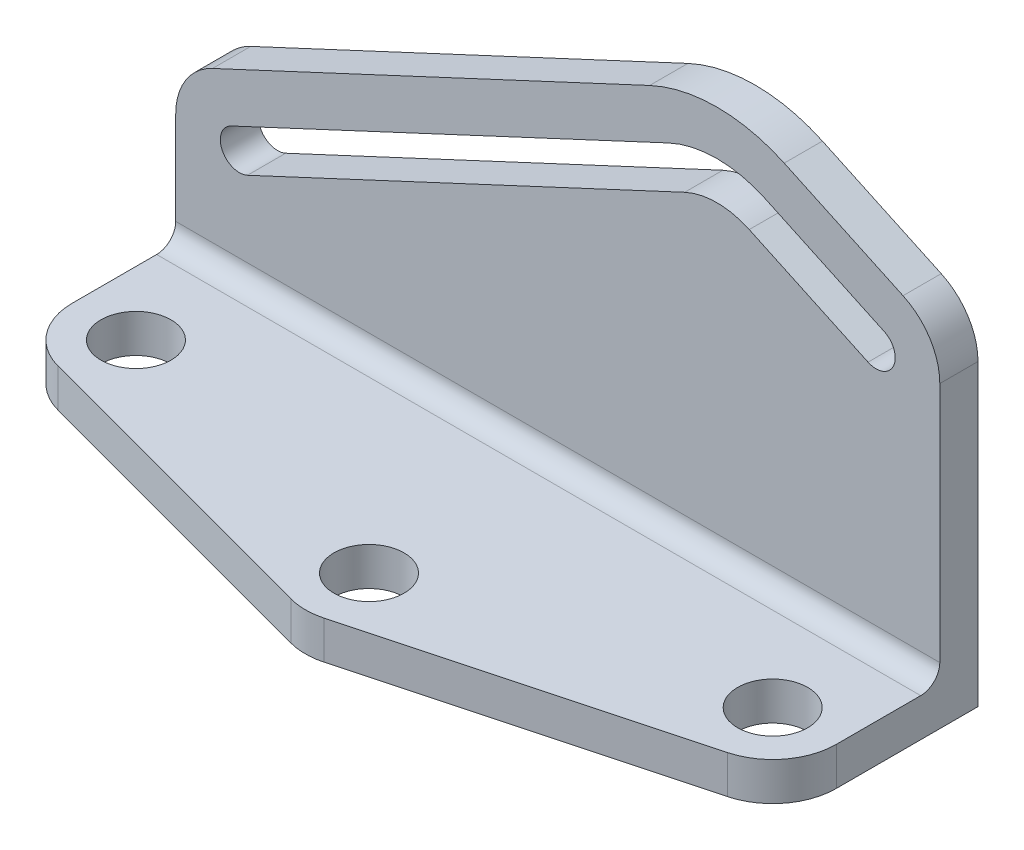
ISO-10303-21;
HEADER;
FILE_DESCRIPTION(('STEP AP214'),'2;1');
FILE_NAME('part.step','',(''),(''),'','','');
FILE_SCHEMA(('AUTOMOTIVE_DESIGN { 1 0 10303 214 1 1 1 1 }'));
ENDSEC;
DATA;
#1=APPLICATION_CONTEXT('core data for automotive mechanical design processes');
#2=APPLICATION_PROTOCOL_DEFINITION('international standard','automotive_design',2000,#1);
#3=PRODUCT_CONTEXT('',#1,'mechanical');
#4=PRODUCT('Part','Part','',(#3));
#5=PRODUCT_RELATED_PRODUCT_CATEGORY('part','',(#4));
#6=PRODUCT_DEFINITION_FORMATION('','',#4);
#7=PRODUCT_DEFINITION_CONTEXT('part definition',#1,'design');
#8=PRODUCT_DEFINITION('design','',#6,#7);
#9=PRODUCT_DEFINITION_SHAPE('','',#8);
#10=(LENGTH_UNIT() NAMED_UNIT(*) SI_UNIT(.MILLI.,.METRE.));
#11=(NAMED_UNIT(*) PLANE_ANGLE_UNIT() SI_UNIT($,.RADIAN.));
#12=(NAMED_UNIT(*) SI_UNIT($,.STERADIAN.) SOLID_ANGLE_UNIT());
#13=UNCERTAINTY_MEASURE_WITH_UNIT(LENGTH_MEASURE(1.E-05),#10,'distance_accuracy_value','');
#14=(GEOMETRIC_REPRESENTATION_CONTEXT(3) GLOBAL_UNCERTAINTY_ASSIGNED_CONTEXT((#13)) GLOBAL_UNIT_ASSIGNED_CONTEXT((#10,
#11,#12)) REPRESENTATION_CONTEXT('',''));
#15=CARTESIAN_POINT('',(0.,0.,0.));
#16=DIRECTION('',(0.,0.,1.));
#17=DIRECTION('',(1.,0.,0.));
#18=AXIS2_PLACEMENT_3D('',#15,#16,#17);
#19=CARTESIAN_POINT('',(60.,0.,6.));
#20=DIRECTION('',(0.,1.,0.));
#21=DIRECTION('',(0.,0.,1.));
#22=AXIS2_PLACEMENT_3D('',#19,#20,#21);
#23=PLANE('',#22);
#24=DIRECTION('',(1.,0.,0.));
#25=VECTOR('',#24,1.);
#26=CARTESIAN_POINT('',(60.,0.,0.));
#27=LINE('',#26,#25);
#28=CARTESIAN_POINT('',(-60.,0.,0.));
#29=VERTEX_POINT('',#28);
#30=CARTESIAN_POINT('',(60.,0.,0.));
#31=VERTEX_POINT('',#30);
#32=EDGE_CURVE('E318',#29,#31,#27,.T.);
#33=ORIENTED_EDGE('',*,*,#32,.T.);
#34=DIRECTION('',(0.,0.,-1.));
#35=VECTOR('',#34,1.);
#36=CARTESIAN_POINT('',(60.,0.,6.));
#37=LINE('',#36,#35);
#38=CARTESIAN_POINT('',(60.,0.,22.249778574343));
#39=VERTEX_POINT('',#38);
#40=EDGE_CURVE('E381',#39,#31,#37,.T.);
#41=ORIENTED_EDGE('',*,*,#40,.F.);
#42=CARTESIAN_POINT('',(50.,0.,22.249778574343));
#43=DIRECTION('',(0.,-1.,0.));
#44=DIRECTION('',(0.,0.,1.));
#45=AXIS2_PLACEMENT_3D('',#42,#43,#44);
#46=CIRCLE('',#45,9.99999999999999);
#47=CARTESIAN_POINT('',(52.5881904510252,0.,31.9090368372337));
#48=VERTEX_POINT('',#47);
#49=EDGE_CURVE('E277',#39,#48,#46,.T.);
#50=ORIENTED_EDGE('',*,*,#49,.T.);
#51=DIRECTION('',(-0.965925826289068,0.,0.258819045102522));
#52=VECTOR('',#51,1.);
#53=CARTESIAN_POINT('',(2.58819045102522,0.,45.3064964587899));
#54=LINE('',#53,#52);
#55=CARTESIAN_POINT('',(2.58819045102522,0.,45.3064964587899));
#56=VERTEX_POINT('',#55);
#57=EDGE_CURVE('E304',#48,#56,#54,.T.);
#58=ORIENTED_EDGE('',*,*,#57,.T.);
#59=CARTESIAN_POINT('',(0.,0.,35.6472381958992));
#60=DIRECTION('',(0.,-1.,0.));
#61=DIRECTION('',(0.,0.,1.));
#62=AXIS2_PLACEMENT_3D('',#59,#60,#61);
#63=CIRCLE('',#62,10.);
#64=CARTESIAN_POINT('',(-2.58819045102521,0.,45.3064964587899));
#65=VERTEX_POINT('',#64);
#66=EDGE_CURVE('E307',#56,#65,#63,.T.);
#67=ORIENTED_EDGE('',*,*,#66,.T.);
#68=DIRECTION('',(-0.965925826289068,0.,-0.258819045102521));
#69=VECTOR('',#68,1.);
#70=CARTESIAN_POINT('',(-52.5881904510252,0.,31.9090368372337));
#71=LINE('',#70,#69);
#72=CARTESIAN_POINT('',(-52.5881904510252,0.,31.9090368372337));
#73=VERTEX_POINT('',#72);
#74=EDGE_CURVE('E310',#65,#73,#71,.T.);
#75=ORIENTED_EDGE('',*,*,#74,.T.);
#76=CARTESIAN_POINT('',(-50.,0.,22.249778574343));
#77=DIRECTION('',(0.,-1.,0.));
#78=DIRECTION('',(0.,0.,1.));
#79=AXIS2_PLACEMENT_3D('',#76,#77,#78);
#80=CIRCLE('',#79,10.);
#81=CARTESIAN_POINT('',(-60.,0.,22.249778574343));
#82=VERTEX_POINT('',#81);
#83=EDGE_CURVE('E284',#73,#82,#80,.T.);
#84=ORIENTED_EDGE('',*,*,#83,.T.);
#85=DIRECTION('',(0.,0.,-1.));
#86=VECTOR('',#85,1.);
#87=CARTESIAN_POINT('',(-60.,0.,6.));
#88=LINE('',#87,#86);
#89=EDGE_CURVE('E345',#82,#29,#88,.T.);
#90=ORIENTED_EDGE('',*,*,#89,.T.);
#91=EDGE_LOOP('',(#33,#41,#50,#58,#67,#75,#84,#90));
#92=FACE_BOUND('',#91,.T.);
#93=CARTESIAN_POINT('',(50.,0.,22.249778574343));
#94=DIRECTION('',(0.,-1.,0.));
#95=DIRECTION('',(0.,0.,-1.));
#96=AXIS2_PLACEMENT_3D('',#93,#94,#95);
#97=CIRCLE('',#96,5.5);
#98=CARTESIAN_POINT('',(50.,0.,16.749778574343));
#99=VERTEX_POINT('',#98);
#100=EDGE_CURVE('E250',#99,#99,#97,.T.);
#101=ORIENTED_EDGE('',*,*,#100,.F.);
#102=EDGE_LOOP('',(#101));
#103=FACE_BOUND('',#102,.T.);
#104=CARTESIAN_POINT('',(0.,0.,35.6472381958992));
#105=DIRECTION('',(0.,-1.,0.));
#106=DIRECTION('',(0.,0.,-1.));
#107=AXIS2_PLACEMENT_3D('',#104,#105,#106);
#108=CIRCLE('',#107,5.50000000000001);
#109=CARTESIAN_POINT('',(0.,0.,30.1472381958992));
#110=VERTEX_POINT('',#109);
#111=EDGE_CURVE('E265',#110,#110,#108,.T.);
#112=ORIENTED_EDGE('',*,*,#111,.F.);
#113=EDGE_LOOP('',(#112));
#114=FACE_BOUND('',#113,.T.);
#115=CARTESIAN_POINT('',(-50.,0.,22.249778574343));
#116=DIRECTION('',(0.,-1.,0.));
#117=DIRECTION('',(0.,0.,-1.));
#118=AXIS2_PLACEMENT_3D('',#115,#116,#117);
#119=CIRCLE('',#118,5.5);
#120=CARTESIAN_POINT('',(-50.,0.,16.749778574343));
#121=VERTEX_POINT('',#120);
#122=EDGE_CURVE('E271',#121,#121,#119,.T.);
#123=ORIENTED_EDGE('',*,*,#122,.F.);
#124=EDGE_LOOP('',(#123));
#125=FACE_BOUND('',#124,.T.);
#126=ADVANCED_FACE('F39',(#92,#103,#114,#125),#23,.F.);
#127=CARTESIAN_POINT('',(60.,46.9446802996746,6.));
#128=DIRECTION('',(-1.,0.,0.));
#129=DIRECTION('',(0.,-1.,0.));
#130=AXIS2_PLACEMENT_3D('',#127,#128,#129);
#131=PLANE('',#130);
#132=DIRECTION('',(0.,1.,0.));
#133=VECTOR('',#132,1.);
#134=CARTESIAN_POINT('',(60.,46.9446802996746,0.));
#135=LINE('',#134,#133);
#136=CARTESIAN_POINT('',(60.,46.9446802996746,0.));
#137=VERTEX_POINT('',#136);
#138=EDGE_CURVE('E348',#31,#137,#135,.T.);
#139=ORIENTED_EDGE('',*,*,#138,.T.);
#140=DIRECTION('',(0.,0.,-1.));
#141=VECTOR('',#140,1.);
#142=CARTESIAN_POINT('',(60.,46.9446802996746,6.));
#143=LINE('',#142,#141);
#144=CARTESIAN_POINT('',(60.,46.9446802996746,6.));
#145=VERTEX_POINT('',#144);
#146=EDGE_CURVE('E378',#145,#137,#143,.T.);
#147=ORIENTED_EDGE('',*,*,#146,.F.);
#148=DIRECTION('',(0.,1.,0.));
#149=VECTOR('',#148,1.);
#150=CARTESIAN_POINT('',(60.,46.9446802996746,6.));
#151=LINE('',#150,#149);
#152=CARTESIAN_POINT('',(60.,9.,6.));
#153=VERTEX_POINT('',#152);
#154=EDGE_CURVE('E329',#153,#145,#151,.T.);
#155=ORIENTED_EDGE('',*,*,#154,.F.);
#156=CARTESIAN_POINT('',(60.,9.,9.));
#157=DIRECTION('',(-1.,0.,0.));
#158=DIRECTION('',(0.,-1.,0.));
#159=AXIS2_PLACEMENT_3D('',#156,#157,#158);
#160=CIRCLE('',#159,3.);
#161=CARTESIAN_POINT('',(60.,6.,9.));
#162=VERTEX_POINT('',#161);
#163=EDGE_CURVE('E47',#153,#162,#160,.T.);
#164=ORIENTED_EDGE('',*,*,#163,.T.);
#165=DIRECTION('',(0.,0.,1.));
#166=VECTOR('',#165,1.);
#167=CARTESIAN_POINT('',(60.,6.,22.249778574343));
#168=LINE('',#167,#166);
#169=CARTESIAN_POINT('',(60.,6.,22.249778574343));
#170=VERTEX_POINT('',#169);
#171=EDGE_CURVE('E283',#162,#170,#168,.T.);
#172=ORIENTED_EDGE('',*,*,#171,.T.);
#173=DIRECTION('',(0.,-1.,0.));
#174=VECTOR('',#173,1.);
#175=CARTESIAN_POINT('',(60.,6.,22.249778574343));
#176=LINE('',#175,#174);
#177=EDGE_CURVE('E301',#170,#39,#176,.T.);
#178=ORIENTED_EDGE('',*,*,#177,.T.);
#179=ORIENTED_EDGE('',*,*,#40,.T.);
#180=EDGE_LOOP('',(#139,#147,#155,#164,#172,#178,#179));
#181=FACE_BOUND('',#180,.T.);
#182=ADVANCED_FACE('F391',(#181),#131,.F.);
#183=CARTESIAN_POINT('',(50.,46.9446802996746,6.));
#184=DIRECTION('',(0.,0.,-1.));
#185=DIRECTION('',(-1.,0.,0.));
#186=AXIS2_PLACEMENT_3D('',#183,#184,#185);
#187=CYLINDRICAL_SURFACE('',#186,9.99999999999999);
#188=CARTESIAN_POINT('',(50.,46.9446802996746,0.));
#189=DIRECTION('',(0.,0.,1.));
#190=DIRECTION('',(-1.,0.,0.));
#191=AXIS2_PLACEMENT_3D('',#188,#189,#190);
#192=CIRCLE('',#191,9.99999999999999);
#193=CARTESIAN_POINT('',(54.226182617407,56.007758170041,0.));
#194=VERTEX_POINT('',#193);
#195=EDGE_CURVE('E350',#137,#194,#192,.T.);
#196=ORIENTED_EDGE('',*,*,#195,.T.);
#197=DIRECTION('',(0.,0.,-1.));
#198=VECTOR('',#197,1.);
#199=CARTESIAN_POINT('',(54.226182617407,56.007758170041,6.));
#200=LINE('',#199,#198);
#201=CARTESIAN_POINT('',(54.226182617407,56.007758170041,6.));
#202=VERTEX_POINT('',#201);
#203=EDGE_CURVE('E375',#202,#194,#200,.T.);
#204=ORIENTED_EDGE('',*,*,#203,.F.);
#205=CARTESIAN_POINT('',(50.,46.9446802996746,6.));
#206=DIRECTION('',(0.,0.,1.));
#207=DIRECTION('',(-1.,0.,0.));
#208=AXIS2_PLACEMENT_3D('',#205,#206,#207);
#209=CIRCLE('',#208,9.99999999999999);
#210=EDGE_CURVE('E331',#145,#202,#209,.T.);
#211=ORIENTED_EDGE('',*,*,#210,.F.);
#212=ORIENTED_EDGE('',*,*,#146,.T.);
#213=EDGE_LOOP('',(#196,#204,#211,#212));
#214=FACE_BOUND('',#213,.T.);
#215=ADVANCED_FACE('F440',(#214),#187,.T.);
#216=CARTESIAN_POINT('',(35.5654565435175,64.7093976450285,6.));
#217=DIRECTION('',(-0.422618261740703,-0.906307787036648,0.));
#218=DIRECTION('',(0.906307787036648,-0.422618261740704,0.));
#219=AXIS2_PLACEMENT_3D('',#216,#217,#218);
#220=PLANE('',#219);
#221=DIRECTION('',(-0.906307787036648,0.422618261740704,0.));
#222=VECTOR('',#221,1.);
#223=CARTESIAN_POINT('',(35.5654565435175,64.7093976450285,0.));
#224=LINE('',#223,#222);
#225=CARTESIAN_POINT('',(35.5654565435175,64.7093976450285,0.));
#226=VERTEX_POINT('',#225);
#227=EDGE_CURVE('E352',#194,#226,#224,.T.);
#228=ORIENTED_EDGE('',*,*,#227,.T.);
#229=DIRECTION('',(0.,0.,-1.));
#230=VECTOR('',#229,1.);
#231=CARTESIAN_POINT('',(35.5654565435175,64.7093976450285,6.));
#232=LINE('',#231,#230);
#233=CARTESIAN_POINT('',(35.5654565435175,64.7093976450285,6.));
#234=VERTEX_POINT('',#233);
#235=EDGE_CURVE('E372',#234,#226,#232,.T.);
#236=ORIENTED_EDGE('',*,*,#235,.F.);
#237=DIRECTION('',(-0.906307787036648,0.422618261740704,0.));
#238=VECTOR('',#237,1.);
#239=CARTESIAN_POINT('',(35.5654565435175,64.7093976450285,6.));
#240=LINE('',#239,#238);
#241=EDGE_CURVE('E334',#202,#234,#240,.T.);
#242=ORIENTED_EDGE('',*,*,#241,.F.);
#243=ORIENTED_EDGE('',*,*,#203,.T.);
#244=EDGE_LOOP('',(#228,#236,#242,#243));
#245=FACE_BOUND('',#244,.T.);
#246=ADVANCED_FACE('F446',(#245),#220,.F.);
#247=CARTESIAN_POINT('',(24.9999999999999,42.0517029691123,6.));
#248=DIRECTION('',(0.,0.,-1.));
#249=DIRECTION('',(-1.,0.,0.));
#250=AXIS2_PLACEMENT_3D('',#247,#248,#249);
#251=CYLINDRICAL_SURFACE('',#250,25.);
#252=CARTESIAN_POINT('',(24.9999999999999,42.0517029691123,0.));
#253=DIRECTION('',(0.,0.,1.));
#254=DIRECTION('',(-1.,0.,0.));
#255=AXIS2_PLACEMENT_3D('',#252,#253,#254);
#256=CIRCLE('',#255,25.);
#257=CARTESIAN_POINT('',(14.4345434564825,64.7093976450285,0.));
#258=VERTEX_POINT('',#257);
#259=EDGE_CURVE('E354',#226,#258,#256,.T.);
#260=ORIENTED_EDGE('',*,*,#259,.T.);
#261=DIRECTION('',(0.,0.,-1.));
#262=VECTOR('',#261,1.);
#263=CARTESIAN_POINT('',(14.4345434564825,64.7093976450285,6.));
#264=LINE('',#263,#262);
#265=CARTESIAN_POINT('',(14.4345434564825,64.7093976450285,6.));
#266=VERTEX_POINT('',#265);
#267=EDGE_CURVE('E369',#266,#258,#264,.T.);
#268=ORIENTED_EDGE('',*,*,#267,.F.);
#269=CARTESIAN_POINT('',(24.9999999999999,42.0517029691123,6.));
#270=DIRECTION('',(0.,0.,1.));
#271=DIRECTION('',(-1.,0.,0.));
#272=AXIS2_PLACEMENT_3D('',#269,#270,#271);
#273=CIRCLE('',#272,25.);
#274=EDGE_CURVE('E336',#234,#266,#273,.T.);
#275=ORIENTED_EDGE('',*,*,#274,.F.);
#276=ORIENTED_EDGE('',*,*,#235,.T.);
#277=EDGE_LOOP('',(#260,#268,#275,#276));
#278=FACE_BOUND('',#277,.T.);
#279=ADVANCED_FACE('F450',(#278),#251,.T.);
#280=CARTESIAN_POINT('',(-54.226182617407,32.6923752622915,6.));
#281=DIRECTION('',(0.422618261740697,-0.906307787036651,0.));
#282=DIRECTION('',(0.906307787036651,0.422618261740697,0.));
#283=AXIS2_PLACEMENT_3D('',#280,#281,#282);
#284=PLANE('',#283);
#285=DIRECTION('',(-0.906307787036651,-0.422618261740697,0.));
#286=VECTOR('',#285,1.);
#287=CARTESIAN_POINT('',(-54.226182617407,32.6923752622915,0.));
#288=LINE('',#287,#286);
#289=CARTESIAN_POINT('',(-54.226182617407,32.6923752622915,0.));
#290=VERTEX_POINT('',#289);
#291=EDGE_CURVE('E356',#258,#290,#288,.T.);
#292=ORIENTED_EDGE('',*,*,#291,.T.);
#293=DIRECTION('',(0.,0.,-1.));
#294=VECTOR('',#293,1.);
#295=CARTESIAN_POINT('',(-54.226182617407,32.6923752622915,6.));
#296=LINE('',#295,#294);
#297=CARTESIAN_POINT('',(-54.226182617407,32.6923752622915,6.));
#298=VERTEX_POINT('',#297);
#299=EDGE_CURVE('E366',#298,#290,#296,.T.);
#300=ORIENTED_EDGE('',*,*,#299,.F.);
#301=DIRECTION('',(-0.906307787036651,-0.422618261740697,0.));
#302=VECTOR('',#301,1.);
#303=CARTESIAN_POINT('',(-54.226182617407,32.6923752622915,6.));
#304=LINE('',#303,#302);
#305=EDGE_CURVE('E338',#266,#298,#304,.T.);
#306=ORIENTED_EDGE('',*,*,#305,.F.);
#307=ORIENTED_EDGE('',*,*,#267,.T.);
#308=EDGE_LOOP('',(#292,#300,#306,#307));
#309=FACE_BOUND('',#308,.T.);
#310=ADVANCED_FACE('F453',(#309),#284,.F.);
#311=CARTESIAN_POINT('',(-50.,23.629297391925,6.));
#312=DIRECTION('',(0.,0.,-1.));
#313=DIRECTION('',(-1.,0.,0.));
#314=AXIS2_PLACEMENT_3D('',#311,#312,#313);
#315=CYLINDRICAL_SURFACE('',#314,10.);
#316=CARTESIAN_POINT('',(-50.,23.629297391925,0.));
#317=DIRECTION('',(0.,0.,1.));
#318=DIRECTION('',(-1.,0.,0.));
#319=AXIS2_PLACEMENT_3D('',#316,#317,#318);
#320=CIRCLE('',#319,10.);
#321=CARTESIAN_POINT('',(-60.,23.629297391925,0.));
#322=VERTEX_POINT('',#321);
#323=EDGE_CURVE('E358',#290,#322,#320,.T.);
#324=ORIENTED_EDGE('',*,*,#323,.T.);
#325=DIRECTION('',(0.,0.,-1.));
#326=VECTOR('',#325,1.);
#327=CARTESIAN_POINT('',(-60.,23.629297391925,6.));
#328=LINE('',#327,#326);
#329=CARTESIAN_POINT('',(-60.,23.629297391925,6.));
#330=VERTEX_POINT('',#329);
#331=EDGE_CURVE('E363',#330,#322,#328,.T.);
#332=ORIENTED_EDGE('',*,*,#331,.F.);
#333=CARTESIAN_POINT('',(-50.,23.629297391925,6.));
#334=DIRECTION('',(0.,0.,1.));
#335=DIRECTION('',(-1.,0.,0.));
#336=AXIS2_PLACEMENT_3D('',#333,#334,#335);
#337=CIRCLE('',#336,10.);
#338=EDGE_CURVE('E340',#298,#330,#337,.T.);
#339=ORIENTED_EDGE('',*,*,#338,.F.);
#340=ORIENTED_EDGE('',*,*,#299,.T.);
#341=EDGE_LOOP('',(#324,#332,#339,#340));
#342=FACE_BOUND('',#341,.T.);
#343=ADVANCED_FACE('F413',(#342),#315,.T.);
#344=CARTESIAN_POINT('',(-60.,0.,6.));
#345=DIRECTION('',(1.,0.,0.));
#346=DIRECTION('',(0.,0.,-1.));
#347=AXIS2_PLACEMENT_3D('',#344,#345,#346);
#348=PLANE('',#347);
#349=DIRECTION('',(0.,-1.,0.));
#350=VECTOR('',#349,1.);
#351=CARTESIAN_POINT('',(-60.,0.,0.));
#352=LINE('',#351,#350);
#353=EDGE_CURVE('E332',#322,#29,#352,.T.);
#354=ORIENTED_EDGE('',*,*,#353,.T.);
#355=ORIENTED_EDGE('',*,*,#89,.F.);
#356=DIRECTION('',(0.,-1.,0.));
#357=VECTOR('',#356,1.);
#358=CARTESIAN_POINT('',(-60.,6.,22.249778574343));
#359=LINE('',#358,#357);
#360=CARTESIAN_POINT('',(-60.,6.,22.249778574343));
#361=VERTEX_POINT('',#360);
#362=EDGE_CURVE('E315',#361,#82,#359,.T.);
#363=ORIENTED_EDGE('',*,*,#362,.F.);
#364=DIRECTION('',(0.,0.,-1.));
#365=VECTOR('',#364,1.);
#366=CARTESIAN_POINT('',(-60.,6.,6.));
#367=LINE('',#366,#365);
#368=CARTESIAN_POINT('',(-60.,6.,9.));
#369=VERTEX_POINT('',#368);
#370=EDGE_CURVE('E280',#361,#369,#367,.T.);
#371=ORIENTED_EDGE('',*,*,#370,.T.);
#372=CARTESIAN_POINT('',(-60.,9.,9.));
#373=DIRECTION('',(1.,0.,0.));
#374=DIRECTION('',(0.,0.,-1.));
#375=AXIS2_PLACEMENT_3D('',#372,#373,#374);
#376=CIRCLE('',#375,3.);
#377=CARTESIAN_POINT('',(-60.,9.,6.));
#378=VERTEX_POINT('',#377);
#379=EDGE_CURVE('E11',#369,#378,#376,.T.);
#380=ORIENTED_EDGE('',*,*,#379,.T.);
#381=DIRECTION('',(0.,-1.,0.));
#382=VECTOR('',#381,1.);
#383=CARTESIAN_POINT('',(-60.,0.,6.));
#384=LINE('',#383,#382);
#385=EDGE_CURVE('E342',#330,#378,#384,.T.);
#386=ORIENTED_EDGE('',*,*,#385,.F.);
#387=ORIENTED_EDGE('',*,*,#331,.T.);
#388=EDGE_LOOP('',(#354,#355,#363,#371,#380,#386,#387));
#389=FACE_BOUND('',#388,.T.);
#390=ADVANCED_FACE('F405',(#389),#348,.F.);
#391=CARTESIAN_POINT('',(-50.,23.629297391925,6.));
#392=DIRECTION('',(0.,0.,-1.));
#393=DIRECTION('',(-1.,0.,0.));
#394=AXIS2_PLACEMENT_3D('',#391,#392,#393);
#395=PLANE('',#394);
#396=DIRECTION('',(-0.906307787036648,0.422618261740703,0.));
#397=VECTOR('',#396,1.);
#398=CARTESIAN_POINT('',(51.2678547852221,49.6636036607845,6.));
#399=LINE('',#398,#397);
#400=CARTESIAN_POINT('',(51.2678547852221,49.6636036607845,6.));
#401=VERTEX_POINT('',#400);
#402=CARTESIAN_POINT('',(32.6071287113325,58.365243135772,6.));
#403=VERTEX_POINT('',#402);
#404=EDGE_CURVE('E232',#401,#403,#399,.T.);
#405=ORIENTED_EDGE('',*,*,#404,.F.);
#406=CARTESIAN_POINT('',(50.,46.9446802996745,6.));
#407=DIRECTION('',(0.,0.,1.));
#408=DIRECTION('',(-1.,0.,0.));
#409=AXIS2_PLACEMENT_3D('',#406,#407,#408);
#410=CIRCLE('',#409,3.);
#411=CARTESIAN_POINT('',(48.7321452147779,44.2257569385646,6.));
#412=VERTEX_POINT('',#411);
#413=EDGE_CURVE('E54',#412,#401,#410,.T.);
#414=ORIENTED_EDGE('',*,*,#413,.F.);
#415=DIRECTION('',(0.906307787036648,-0.422618261740703,0.));
#416=VECTOR('',#415,1.);
#417=CARTESIAN_POINT('',(48.7321452147779,44.2257569385646,6.));
#418=LINE('',#417,#416);
#419=CARTESIAN_POINT('',(30.0714191408883,52.9273964135521,6.));
#420=VERTEX_POINT('',#419);
#421=EDGE_CURVE('E212',#420,#412,#418,.T.);
#422=ORIENTED_EDGE('',*,*,#421,.F.);
#423=CARTESIAN_POINT('',(24.9999999999999,42.0517029691123,6.));
#424=DIRECTION('',(0.,0.,-1.));
#425=DIRECTION('',(1.,0.,0.));
#426=AXIS2_PLACEMENT_3D('',#423,#424,#425);
#427=CIRCLE('',#426,12.);
#428=CARTESIAN_POINT('',(19.9285808591115,52.9273964135521,6.));
#429=VERTEX_POINT('',#428);
#430=EDGE_CURVE('E215',#429,#420,#427,.T.);
#431=ORIENTED_EDGE('',*,*,#430,.F.);
#432=DIRECTION('',(0.906307787036651,0.422618261740697,0.));
#433=VECTOR('',#432,1.);
#434=CARTESIAN_POINT('',(19.9285808591115,52.9273964135521,6.));
#435=LINE('',#434,#433);
#436=CARTESIAN_POINT('',(-48.7321452147779,20.9103740308151,6.));
#437=VERTEX_POINT('',#436);
#438=EDGE_CURVE('E243',#437,#429,#435,.T.);
#439=ORIENTED_EDGE('',*,*,#438,.F.);
#440=CARTESIAN_POINT('',(-50.,23.629297391925,6.));
#441=DIRECTION('',(0.,0.,1.));
#442=DIRECTION('',(1.,0.,0.));
#443=AXIS2_PLACEMENT_3D('',#440,#441,#442);
#444=CIRCLE('',#443,3.);
#445=CARTESIAN_POINT('',(-51.2678547852221,26.348220753035,6.));
#446=VERTEX_POINT('',#445);
#447=EDGE_CURVE('E240',#446,#437,#444,.T.);
#448=ORIENTED_EDGE('',*,*,#447,.F.);
#449=DIRECTION('',(-0.906307787036651,-0.422618261740697,0.));
#450=VECTOR('',#449,1.);
#451=CARTESIAN_POINT('',(17.3928712886673,58.365243135772,6.));
#452=LINE('',#451,#450);
#453=CARTESIAN_POINT('',(17.3928712886673,58.365243135772,6.));
#454=VERTEX_POINT('',#453);
#455=EDGE_CURVE('E237',#454,#446,#452,.T.);
#456=ORIENTED_EDGE('',*,*,#455,.F.);
#457=CARTESIAN_POINT('',(24.9999999999999,42.0517029691123,6.));
#458=DIRECTION('',(0.,0.,1.));
#459=DIRECTION('',(1.,0.,0.));
#460=AXIS2_PLACEMENT_3D('',#457,#458,#459);
#461=CIRCLE('',#460,18.);
#462=EDGE_CURVE('E234',#403,#454,#461,.T.);
#463=ORIENTED_EDGE('',*,*,#462,.F.);
#464=EDGE_LOOP('',(#405,#414,#422,#431,#439,#448,#456,#463));
#465=FACE_BOUND('',#464,.T.);
#466=ORIENTED_EDGE('',*,*,#385,.T.);
#467=DIRECTION('',(1.,0.,0.));
#468=VECTOR('',#467,1.);
#469=CARTESIAN_POINT('',(-50.,9.,6.));
#470=LINE('',#469,#468);
#471=EDGE_CURVE('E384',#378,#153,#470,.T.);
#472=ORIENTED_EDGE('',*,*,#471,.T.);
#473=ORIENTED_EDGE('',*,*,#154,.T.);
#474=ORIENTED_EDGE('',*,*,#210,.T.);
#475=ORIENTED_EDGE('',*,*,#241,.T.);
#476=ORIENTED_EDGE('',*,*,#274,.T.);
#477=ORIENTED_EDGE('',*,*,#305,.T.);
#478=ORIENTED_EDGE('',*,*,#338,.T.);
#479=EDGE_LOOP('',(#466,#472,#473,#474,#475,#476,#477,#478));
#480=FACE_BOUND('',#479,.T.);
#481=ADVANCED_FACE('F407',(#465,#480),#395,.F.);
#482=CARTESIAN_POINT('',(-50.,23.629297391925,0.));
#483=DIRECTION('',(0.,0.,-1.));
#484=DIRECTION('',(-1.,0.,0.));
#485=AXIS2_PLACEMENT_3D('',#482,#483,#484);
#486=PLANE('',#485);
#487=CARTESIAN_POINT('',(50.,46.9446802996745,0.));
#488=DIRECTION('',(0.,0.,1.));
#489=DIRECTION('',(-1.,0.,0.));
#490=AXIS2_PLACEMENT_3D('',#487,#488,#489);
#491=CIRCLE('',#490,3.);
#492=CARTESIAN_POINT('',(48.7321452147779,44.2257569385646,0.));
#493=VERTEX_POINT('',#492);
#494=CARTESIAN_POINT('',(51.2678547852221,49.6636036607845,0.));
#495=VERTEX_POINT('',#494);
#496=EDGE_CURVE('E195',#493,#495,#491,.T.);
#497=ORIENTED_EDGE('',*,*,#496,.T.);
#498=DIRECTION('',(-0.906307787036648,0.422618261740703,0.));
#499=VECTOR('',#498,1.);
#500=CARTESIAN_POINT('',(51.2678547852221,49.6636036607845,0.));
#501=LINE('',#500,#499);
#502=CARTESIAN_POINT('',(32.6071287113325,58.3652431357719,0.));
#503=VERTEX_POINT('',#502);
#504=EDGE_CURVE('E204',#495,#503,#501,.T.);
#505=ORIENTED_EDGE('',*,*,#504,.T.);
#506=CARTESIAN_POINT('',(24.9999999999999,42.0517029691123,0.));
#507=DIRECTION('',(0.,0.,1.));
#508=DIRECTION('',(1.,0.,0.));
#509=AXIS2_PLACEMENT_3D('',#506,#507,#508);
#510=CIRCLE('',#509,18.);
#511=CARTESIAN_POINT('',(17.3928712886673,58.365243135772,0.));
#512=VERTEX_POINT('',#511);
#513=EDGE_CURVE('E62',#503,#512,#510,.T.);
#514=ORIENTED_EDGE('',*,*,#513,.T.);
#515=DIRECTION('',(-0.906307787036651,-0.422618261740697,0.));
#516=VECTOR('',#515,1.);
#517=CARTESIAN_POINT('',(17.3928712886673,58.365243135772,0.));
#518=LINE('',#517,#516);
#519=CARTESIAN_POINT('',(-51.2678547852221,26.348220753035,0.));
#520=VERTEX_POINT('',#519);
#521=EDGE_CURVE('E219',#512,#520,#518,.T.);
#522=ORIENTED_EDGE('',*,*,#521,.T.);
#523=CARTESIAN_POINT('',(-50.,23.629297391925,0.));
#524=DIRECTION('',(0.,0.,1.));
#525=DIRECTION('',(1.,0.,0.));
#526=AXIS2_PLACEMENT_3D('',#523,#524,#525);
#527=CIRCLE('',#526,3.);
#528=CARTESIAN_POINT('',(-48.7321452147779,20.9103740308151,0.));
#529=VERTEX_POINT('',#528);
#530=EDGE_CURVE('E222',#520,#529,#527,.T.);
#531=ORIENTED_EDGE('',*,*,#530,.T.);
#532=DIRECTION('',(0.906307787036651,0.422618261740697,0.));
#533=VECTOR('',#532,1.);
#534=CARTESIAN_POINT('',(19.9285808591115,52.9273964135521,0.));
#535=LINE('',#534,#533);
#536=CARTESIAN_POINT('',(19.9285808591115,52.9273964135521,0.));
#537=VERTEX_POINT('',#536);
#538=EDGE_CURVE('E225',#529,#537,#535,.T.);
#539=ORIENTED_EDGE('',*,*,#538,.T.);
#540=CARTESIAN_POINT('',(24.9999999999999,42.0517029691123,0.));
#541=DIRECTION('',(0.,0.,-1.));
#542=DIRECTION('',(1.,0.,0.));
#543=AXIS2_PLACEMENT_3D('',#540,#541,#542);
#544=CIRCLE('',#543,12.);
#545=CARTESIAN_POINT('',(30.0714191408883,52.9273964135521,0.));
#546=VERTEX_POINT('',#545);
#547=EDGE_CURVE('E228',#537,#546,#544,.T.);
#548=ORIENTED_EDGE('',*,*,#547,.T.);
#549=DIRECTION('',(0.906307787036648,-0.422618261740703,0.));
#550=VECTOR('',#549,1.);
#551=CARTESIAN_POINT('',(48.7321452147779,44.2257569385646,0.));
#552=LINE('',#551,#550);
#553=EDGE_CURVE('E201',#546,#493,#552,.T.);
#554=ORIENTED_EDGE('',*,*,#553,.T.);
#555=EDGE_LOOP('',(#497,#505,#514,#522,#531,#539,#548,#554));
#556=FACE_BOUND('',#555,.T.);
#557=ORIENTED_EDGE('',*,*,#32,.F.);
#558=ORIENTED_EDGE('',*,*,#353,.F.);
#559=ORIENTED_EDGE('',*,*,#323,.F.);
#560=ORIENTED_EDGE('',*,*,#291,.F.);
#561=ORIENTED_EDGE('',*,*,#259,.F.);
#562=ORIENTED_EDGE('',*,*,#227,.F.);
#563=ORIENTED_EDGE('',*,*,#195,.F.);
#564=ORIENTED_EDGE('',*,*,#138,.F.);
#565=EDGE_LOOP('',(#557,#558,#559,#560,#561,#562,#563,#564));
#566=FACE_BOUND('',#565,.T.);
#567=ADVANCED_FACE('F208',(#556,#566),#486,.T.);
#568=CARTESIAN_POINT('',(-50.,6.,22.249778574343));
#569=DIRECTION('',(0.,-1.,0.));
#570=DIRECTION('',(0.,0.,-1.));
#571=AXIS2_PLACEMENT_3D('',#568,#569,#570);
#572=CYLINDRICAL_SURFACE('',#571,10.);
#573=ORIENTED_EDGE('',*,*,#83,.F.);
#574=DIRECTION('',(0.,-1.,0.));
#575=VECTOR('',#574,1.);
#576=CARTESIAN_POINT('',(-52.5881904510252,6.,31.9090368372337));
#577=LINE('',#576,#575);
#578=CARTESIAN_POINT('',(-52.5881904510252,6.,31.9090368372337));
#579=VERTEX_POINT('',#578);
#580=EDGE_CURVE('E319',#579,#73,#577,.T.);
#581=ORIENTED_EDGE('',*,*,#580,.F.);
#582=CARTESIAN_POINT('',(-50.,6.,22.249778574343));
#583=DIRECTION('',(0.,-1.,0.));
#584=DIRECTION('',(0.,0.,1.));
#585=AXIS2_PLACEMENT_3D('',#582,#583,#584);
#586=CIRCLE('',#585,10.);
#587=EDGE_CURVE('E298',#579,#361,#586,.T.);
#588=ORIENTED_EDGE('',*,*,#587,.T.);
#589=ORIENTED_EDGE('',*,*,#362,.T.);
#590=EDGE_LOOP('',(#573,#581,#588,#589));
#591=FACE_BOUND('',#590,.T.);
#592=ADVANCED_FACE('F423',(#591),#572,.T.);
#593=CARTESIAN_POINT('',(-52.5881904510252,6.,31.9090368372337));
#594=DIRECTION('',(-0.258819045102521,0.,0.965925826289068));
#595=DIRECTION('',(0.965925826289068,0.,0.258819045102521));
#596=AXIS2_PLACEMENT_3D('',#593,#594,#595);
#597=PLANE('',#596);
#598=ORIENTED_EDGE('',*,*,#74,.F.);
#599=DIRECTION('',(0.,-1.,0.));
#600=VECTOR('',#599,1.);
#601=CARTESIAN_POINT('',(-2.58819045102521,6.,45.3064964587899));
#602=LINE('',#601,#600);
#603=CARTESIAN_POINT('',(-2.58819045102521,6.,45.3064964587899));
#604=VERTEX_POINT('',#603);
#605=EDGE_CURVE('E321',#604,#65,#602,.T.);
#606=ORIENTED_EDGE('',*,*,#605,.F.);
#607=DIRECTION('',(-0.965925826289068,0.,-0.258819045102521));
#608=VECTOR('',#607,1.);
#609=CARTESIAN_POINT('',(-52.5881904510252,6.,31.9090368372337));
#610=LINE('',#609,#608);
#611=EDGE_CURVE('E295',#604,#579,#610,.T.);
#612=ORIENTED_EDGE('',*,*,#611,.T.);
#613=ORIENTED_EDGE('',*,*,#580,.T.);
#614=EDGE_LOOP('',(#598,#606,#612,#613));
#615=FACE_BOUND('',#614,.T.);
#616=ADVANCED_FACE('F507',(#615),#597,.T.);
#617=CARTESIAN_POINT('',(0.,6.,35.6472381958992));
#618=DIRECTION('',(0.,-1.,0.));
#619=DIRECTION('',(0.,0.,-1.));
#620=AXIS2_PLACEMENT_3D('',#617,#618,#619);
#621=CYLINDRICAL_SURFACE('',#620,10.);
#622=ORIENTED_EDGE('',*,*,#66,.F.);
#623=DIRECTION('',(0.,-1.,0.));
#624=VECTOR('',#623,1.);
#625=CARTESIAN_POINT('',(2.58819045102522,6.,45.3064964587899));
#626=LINE('',#625,#624);
#627=CARTESIAN_POINT('',(2.58819045102522,6.,45.3064964587899));
#628=VERTEX_POINT('',#627);
#629=EDGE_CURVE('E323',#628,#56,#626,.T.);
#630=ORIENTED_EDGE('',*,*,#629,.F.);
#631=CARTESIAN_POINT('',(0.,6.,35.6472381958992));
#632=DIRECTION('',(0.,-1.,0.));
#633=DIRECTION('',(0.,0.,1.));
#634=AXIS2_PLACEMENT_3D('',#631,#632,#633);
#635=CIRCLE('',#634,10.);
#636=EDGE_CURVE('E292',#628,#604,#635,.T.);
#637=ORIENTED_EDGE('',*,*,#636,.T.);
#638=ORIENTED_EDGE('',*,*,#605,.T.);
#639=EDGE_LOOP('',(#622,#630,#637,#638));
#640=FACE_BOUND('',#639,.T.);
#641=ADVANCED_FACE('F430',(#640),#621,.T.);
#642=CARTESIAN_POINT('',(2.58819045102522,6.,45.3064964587899));
#643=DIRECTION('',(0.258819045102522,0.,0.965925826289068));
#644=DIRECTION('',(0.965925826289068,0.,-0.258819045102522));
#645=AXIS2_PLACEMENT_3D('',#642,#643,#644);
#646=PLANE('',#645);
#647=ORIENTED_EDGE('',*,*,#57,.F.);
#648=DIRECTION('',(0.,-1.,0.));
#649=VECTOR('',#648,1.);
#650=CARTESIAN_POINT('',(52.5881904510252,6.,31.9090368372337));
#651=LINE('',#650,#649);
#652=CARTESIAN_POINT('',(52.5881904510252,6.,31.9090368372337));
#653=VERTEX_POINT('',#652);
#654=EDGE_CURVE('E325',#653,#48,#651,.T.);
#655=ORIENTED_EDGE('',*,*,#654,.F.);
#656=DIRECTION('',(-0.965925826289068,0.,0.258819045102522));
#657=VECTOR('',#656,1.);
#658=CARTESIAN_POINT('',(2.58819045102522,6.,45.3064964587899));
#659=LINE('',#658,#657);
#660=EDGE_CURVE('E289',#653,#628,#659,.T.);
#661=ORIENTED_EDGE('',*,*,#660,.T.);
#662=ORIENTED_EDGE('',*,*,#629,.T.);
#663=EDGE_LOOP('',(#647,#655,#661,#662));
#664=FACE_BOUND('',#663,.T.);
#665=ADVANCED_FACE('F434',(#664),#646,.T.);
#666=CARTESIAN_POINT('',(50.,6.,22.249778574343));
#667=DIRECTION('',(0.,-1.,0.));
#668=DIRECTION('',(0.,0.,-1.));
#669=AXIS2_PLACEMENT_3D('',#666,#667,#668);
#670=CYLINDRICAL_SURFACE('',#669,9.99999999999999);
#671=ORIENTED_EDGE('',*,*,#49,.F.);
#672=ORIENTED_EDGE('',*,*,#177,.F.);
#673=CARTESIAN_POINT('',(50.,6.,22.249778574343));
#674=DIRECTION('',(0.,-1.,0.));
#675=DIRECTION('',(0.,0.,1.));
#676=AXIS2_PLACEMENT_3D('',#673,#674,#675);
#677=CIRCLE('',#676,9.99999999999999);
#678=EDGE_CURVE('E286',#170,#653,#677,.T.);
#679=ORIENTED_EDGE('',*,*,#678,.T.);
#680=ORIENTED_EDGE('',*,*,#654,.T.);
#681=EDGE_LOOP('',(#671,#672,#679,#680));
#682=FACE_BOUND('',#681,.T.);
#683=ADVANCED_FACE('F437',(#682),#670,.T.);
#684=CARTESIAN_POINT('',(-50.,6.,22.249778574343));
#685=DIRECTION('',(0.,1.,0.));
#686=DIRECTION('',(0.,0.,1.));
#687=AXIS2_PLACEMENT_3D('',#684,#685,#686);
#688=PLANE('',#687);
#689=CARTESIAN_POINT('',(50.,6.,22.249778574343));
#690=DIRECTION('',(0.,-1.,0.));
#691=DIRECTION('',(0.,0.,-1.));
#692=AXIS2_PLACEMENT_3D('',#689,#690,#691);
#693=CIRCLE('',#692,5.5);
#694=CARTESIAN_POINT('',(50.,6.,16.749778574343));
#695=VERTEX_POINT('',#694);
#696=EDGE_CURVE('E262',#695,#695,#693,.T.);
#697=ORIENTED_EDGE('',*,*,#696,.T.);
#698=EDGE_LOOP('',(#697));
#699=FACE_BOUND('',#698,.T.);
#700=CARTESIAN_POINT('',(0.,6.,35.6472381958992));
#701=DIRECTION('',(0.,-1.,0.));
#702=DIRECTION('',(0.,0.,-1.));
#703=AXIS2_PLACEMENT_3D('',#700,#701,#702);
#704=CIRCLE('',#703,5.50000000000001);
#705=CARTESIAN_POINT('',(0.,6.,30.1472381958992));
#706=VERTEX_POINT('',#705);
#707=EDGE_CURVE('E268',#706,#706,#704,.T.);
#708=ORIENTED_EDGE('',*,*,#707,.T.);
#709=EDGE_LOOP('',(#708));
#710=FACE_BOUND('',#709,.T.);
#711=CARTESIAN_POINT('',(-50.,6.,22.249778574343));
#712=DIRECTION('',(0.,-1.,0.));
#713=DIRECTION('',(0.,0.,-1.));
#714=AXIS2_PLACEMENT_3D('',#711,#712,#713);
#715=CIRCLE('',#714,5.5);
#716=CARTESIAN_POINT('',(-50.,6.,16.749778574343));
#717=VERTEX_POINT('',#716);
#718=EDGE_CURVE('E274',#717,#717,#715,.T.);
#719=ORIENTED_EDGE('',*,*,#718,.T.);
#720=EDGE_LOOP('',(#719));
#721=FACE_BOUND('',#720,.T.);
#722=ORIENTED_EDGE('',*,*,#171,.F.);
#723=DIRECTION('',(1.,0.,0.));
#724=VECTOR('',#723,1.);
#725=CARTESIAN_POINT('',(-50.,6.,9.));
#726=LINE('',#725,#724);
#727=EDGE_CURVE('E387',#162,#369,#726,.F.);
#728=ORIENTED_EDGE('',*,*,#727,.T.);
#729=ORIENTED_EDGE('',*,*,#370,.F.);
#730=ORIENTED_EDGE('',*,*,#587,.F.);
#731=ORIENTED_EDGE('',*,*,#611,.F.);
#732=ORIENTED_EDGE('',*,*,#636,.F.);
#733=ORIENTED_EDGE('',*,*,#660,.F.);
#734=ORIENTED_EDGE('',*,*,#678,.F.);
#735=EDGE_LOOP('',(#722,#728,#729,#730,#731,#732,#733,#734));
#736=FACE_BOUND('',#735,.T.);
#737=ADVANCED_FACE('F399',(#699,#710,#721,#736),#688,.T.);
#738=CARTESIAN_POINT('',(-50.,6.,22.249778574343));
#739=DIRECTION('',(0.,-1.,0.));
#740=DIRECTION('',(0.,0.,-1.));
#741=AXIS2_PLACEMENT_3D('',#738,#739,#740);
#742=CYLINDRICAL_SURFACE('',#741,5.5);
#743=ORIENTED_EDGE('',*,*,#718,.F.);
#744=EDGE_LOOP('',(#743));
#745=FACE_BOUND('',#744,.T.);
#746=ORIENTED_EDGE('',*,*,#122,.T.);
#747=EDGE_LOOP('',(#746));
#748=FACE_BOUND('',#747,.T.);
#749=ADVANCED_FACE('F548',(#745,#748),#742,.F.);
#750=CARTESIAN_POINT('',(0.,6.,35.6472381958992));
#751=DIRECTION('',(0.,-1.,0.));
#752=DIRECTION('',(0.,0.,-1.));
#753=AXIS2_PLACEMENT_3D('',#750,#751,#752);
#754=CYLINDRICAL_SURFACE('',#753,5.50000000000001);
#755=ORIENTED_EDGE('',*,*,#707,.F.);
#756=EDGE_LOOP('',(#755));
#757=FACE_BOUND('',#756,.T.);
#758=ORIENTED_EDGE('',*,*,#111,.T.);
#759=EDGE_LOOP('',(#758));
#760=FACE_BOUND('',#759,.T.);
#761=ADVANCED_FACE('F553',(#757,#760),#754,.F.);
#762=CARTESIAN_POINT('',(50.,6.,22.249778574343));
#763=DIRECTION('',(0.,-1.,0.));
#764=DIRECTION('',(0.,0.,-1.));
#765=AXIS2_PLACEMENT_3D('',#762,#763,#764);
#766=CYLINDRICAL_SURFACE('',#765,5.5);
#767=ORIENTED_EDGE('',*,*,#696,.F.);
#768=EDGE_LOOP('',(#767));
#769=FACE_BOUND('',#768,.T.);
#770=ORIENTED_EDGE('',*,*,#100,.T.);
#771=EDGE_LOOP('',(#770));
#772=FACE_BOUND('',#771,.T.);
#773=ADVANCED_FACE('F563',(#769,#772),#766,.F.);
#774=CARTESIAN_POINT('',(-50.,9.,9.));
#775=DIRECTION('',(1.,0.,0.));
#776=DIRECTION('',(0.,0.,-1.));
#777=AXIS2_PLACEMENT_3D('',#774,#775,#776);
#778=CYLINDRICAL_SURFACE('',#777,3.);
#779=ORIENTED_EDGE('',*,*,#379,.F.);
#780=ORIENTED_EDGE('',*,*,#727,.F.);
#781=ORIENTED_EDGE('',*,*,#163,.F.);
#782=ORIENTED_EDGE('',*,*,#471,.F.);
#783=EDGE_LOOP('',(#779,#780,#781,#782));
#784=FACE_BOUND('',#783,.T.);
#785=ADVANCED_FACE('F41',(#784),#778,.F.);
#786=CARTESIAN_POINT('',(50.,46.9446802996745,0.));
#787=DIRECTION('',(0.,0.,1.));
#788=DIRECTION('',(1.,0.,0.));
#789=AXIS2_PLACEMENT_3D('',#786,#787,#788);
#790=CYLINDRICAL_SURFACE('',#789,3.);
#791=ORIENTED_EDGE('',*,*,#413,.T.);
#792=DIRECTION('',(0.,0.,1.));
#793=VECTOR('',#792,1.);
#794=CARTESIAN_POINT('',(51.2678547852221,49.6636036607845,0.));
#795=LINE('',#794,#793);
#796=EDGE_CURVE('E191',#495,#401,#795,.T.);
#797=ORIENTED_EDGE('',*,*,#796,.F.);
#798=ORIENTED_EDGE('',*,*,#496,.F.);
#799=DIRECTION('',(0.,0.,1.));
#800=VECTOR('',#799,1.);
#801=CARTESIAN_POINT('',(48.7321452147779,44.2257569385646,0.));
#802=LINE('',#801,#800);
#803=EDGE_CURVE('E248',#493,#412,#802,.T.);
#804=ORIENTED_EDGE('',*,*,#803,.T.);
#805=EDGE_LOOP('',(#791,#797,#798,#804));
#806=FACE_BOUND('',#805,.T.);
#807=ADVANCED_FACE('F193',(#806),#790,.F.);
#808=CARTESIAN_POINT('',(48.7321452147779,44.2257569385646,0.));
#809=DIRECTION('',(-0.422618261740703,-0.906307787036648,0.));
#810=DIRECTION('',(0.906307787036648,-0.422618261740703,0.));
#811=AXIS2_PLACEMENT_3D('',#808,#809,#810);
#812=PLANE('',#811);
#813=ORIENTED_EDGE('',*,*,#421,.T.);
#814=ORIENTED_EDGE('',*,*,#803,.F.);
#815=ORIENTED_EDGE('',*,*,#553,.F.);
#816=DIRECTION('',(0.,0.,1.));
#817=VECTOR('',#816,1.);
#818=CARTESIAN_POINT('',(30.0714191408883,52.9273964135521,0.));
#819=LINE('',#818,#817);
#820=EDGE_CURVE('E251',#546,#420,#819,.T.);
#821=ORIENTED_EDGE('',*,*,#820,.T.);
#822=EDGE_LOOP('',(#813,#814,#815,#821));
#823=FACE_BOUND('',#822,.T.);
#824=ADVANCED_FACE('F623',(#823),#812,.F.);
#825=CARTESIAN_POINT('',(24.9999999999999,42.0517029691123,0.));
#826=DIRECTION('',(0.,0.,1.));
#827=DIRECTION('',(1.,0.,0.));
#828=AXIS2_PLACEMENT_3D('',#825,#826,#827);
#829=CYLINDRICAL_SURFACE('',#828,12.);
#830=ORIENTED_EDGE('',*,*,#430,.T.);
#831=ORIENTED_EDGE('',*,*,#820,.F.);
#832=ORIENTED_EDGE('',*,*,#547,.F.);
#833=DIRECTION('',(0.,0.,1.));
#834=VECTOR('',#833,1.);
#835=CARTESIAN_POINT('',(19.9285808591115,52.9273964135521,0.));
#836=LINE('',#835,#834);
#837=EDGE_CURVE('E253',#537,#429,#836,.T.);
#838=ORIENTED_EDGE('',*,*,#837,.T.);
#839=EDGE_LOOP('',(#830,#831,#832,#838));
#840=FACE_BOUND('',#839,.T.);
#841=ADVANCED_FACE('F633',(#840),#829,.T.);
#842=CARTESIAN_POINT('',(19.9285808591115,52.9273964135521,0.));
#843=DIRECTION('',(0.422618261740697,-0.906307787036651,0.));
#844=DIRECTION('',(0.906307787036651,0.422618261740697,0.));
#845=AXIS2_PLACEMENT_3D('',#842,#843,#844);
#846=PLANE('',#845);
#847=ORIENTED_EDGE('',*,*,#438,.T.);
#848=ORIENTED_EDGE('',*,*,#837,.F.);
#849=ORIENTED_EDGE('',*,*,#538,.F.);
#850=DIRECTION('',(0.,0.,1.));
#851=VECTOR('',#850,1.);
#852=CARTESIAN_POINT('',(-48.7321452147779,20.9103740308151,0.));
#853=LINE('',#852,#851);
#854=EDGE_CURVE('E255',#529,#437,#853,.T.);
#855=ORIENTED_EDGE('',*,*,#854,.T.);
#856=EDGE_LOOP('',(#847,#848,#849,#855));
#857=FACE_BOUND('',#856,.T.);
#858=ADVANCED_FACE('F644',(#857),#846,.F.);
#859=CARTESIAN_POINT('',(-50.,23.629297391925,0.));
#860=DIRECTION('',(0.,0.,1.));
#861=DIRECTION('',(1.,0.,0.));
#862=AXIS2_PLACEMENT_3D('',#859,#860,#861);
#863=CYLINDRICAL_SURFACE('',#862,3.);
#864=ORIENTED_EDGE('',*,*,#447,.T.);
#865=ORIENTED_EDGE('',*,*,#854,.F.);
#866=ORIENTED_EDGE('',*,*,#530,.F.);
#867=DIRECTION('',(0.,0.,1.));
#868=VECTOR('',#867,1.);
#869=CARTESIAN_POINT('',(-51.2678547852221,26.348220753035,0.));
#870=LINE('',#869,#868);
#871=EDGE_CURVE('E257',#520,#446,#870,.T.);
#872=ORIENTED_EDGE('',*,*,#871,.T.);
#873=EDGE_LOOP('',(#864,#865,#866,#872));
#874=FACE_BOUND('',#873,.T.);
#875=ADVANCED_FACE('F655',(#874),#863,.F.);
#876=CARTESIAN_POINT('',(17.3928712886673,58.365243135772,0.));
#877=DIRECTION('',(-0.422618261740697,0.906307787036651,0.));
#878=DIRECTION('',(-0.906307787036651,-0.422618261740697,0.));
#879=AXIS2_PLACEMENT_3D('',#876,#877,#878);
#880=PLANE('',#879);
#881=ORIENTED_EDGE('',*,*,#455,.T.);
#882=ORIENTED_EDGE('',*,*,#871,.F.);
#883=ORIENTED_EDGE('',*,*,#521,.F.);
#884=DIRECTION('',(0.,0.,1.));
#885=VECTOR('',#884,1.);
#886=CARTESIAN_POINT('',(17.3928712886673,58.365243135772,0.));
#887=LINE('',#886,#885);
#888=EDGE_CURVE('E259',#512,#454,#887,.T.);
#889=ORIENTED_EDGE('',*,*,#888,.T.);
#890=EDGE_LOOP('',(#881,#882,#883,#889));
#891=FACE_BOUND('',#890,.T.);
#892=ADVANCED_FACE('F666',(#891),#880,.F.);
#893=CARTESIAN_POINT('',(24.9999999999999,42.0517029691123,0.));
#894=DIRECTION('',(0.,0.,1.));
#895=DIRECTION('',(1.,0.,0.));
#896=AXIS2_PLACEMENT_3D('',#893,#894,#895);
#897=CYLINDRICAL_SURFACE('',#896,18.);
#898=ORIENTED_EDGE('',*,*,#462,.T.);
#899=ORIENTED_EDGE('',*,*,#888,.F.);
#900=ORIENTED_EDGE('',*,*,#513,.F.);
#901=DIRECTION('',(0.,0.,1.));
#902=VECTOR('',#901,1.);
#903=CARTESIAN_POINT('',(32.6071287113325,58.365243135772,0.));
#904=LINE('',#903,#902);
#905=EDGE_CURVE('E200',#503,#403,#904,.T.);
#906=ORIENTED_EDGE('',*,*,#905,.T.);
#907=EDGE_LOOP('',(#898,#899,#900,#906));
#908=FACE_BOUND('',#907,.T.);
#909=ADVANCED_FACE('F677',(#908),#897,.F.);
#910=CARTESIAN_POINT('',(51.2678547852221,49.6636036607845,0.));
#911=DIRECTION('',(0.422618261740703,0.906307787036648,0.));
#912=DIRECTION('',(-0.906307787036648,0.422618261740703,0.));
#913=AXIS2_PLACEMENT_3D('',#910,#911,#912);
#914=PLANE('',#913);
#915=ORIENTED_EDGE('',*,*,#404,.T.);
#916=ORIENTED_EDGE('',*,*,#905,.F.);
#917=ORIENTED_EDGE('',*,*,#504,.F.);
#918=ORIENTED_EDGE('',*,*,#796,.T.);
#919=EDGE_LOOP('',(#915,#916,#917,#918));
#920=FACE_BOUND('',#919,.T.);
#921=ADVANCED_FACE('F205',(#920),#914,.F.);
#922=CLOSED_SHELL('',(#126,#182,#215,#246,#279,#310,#343,#390,#481,#567,#592,#616,#641,#665,
#683,#737,#749,#761,#773,#785,#807,#824,#841,#858,#875,#892,#909,#921));
#923=MANIFOLD_SOLID_BREP('B2',#922);
#924=ADVANCED_BREP_SHAPE_REPRESENTATION('',(#18,#923),#14);
#925=SHAPE_DEFINITION_REPRESENTATION(#9,#924);
ENDSEC;
END-ISO-10303-21;
